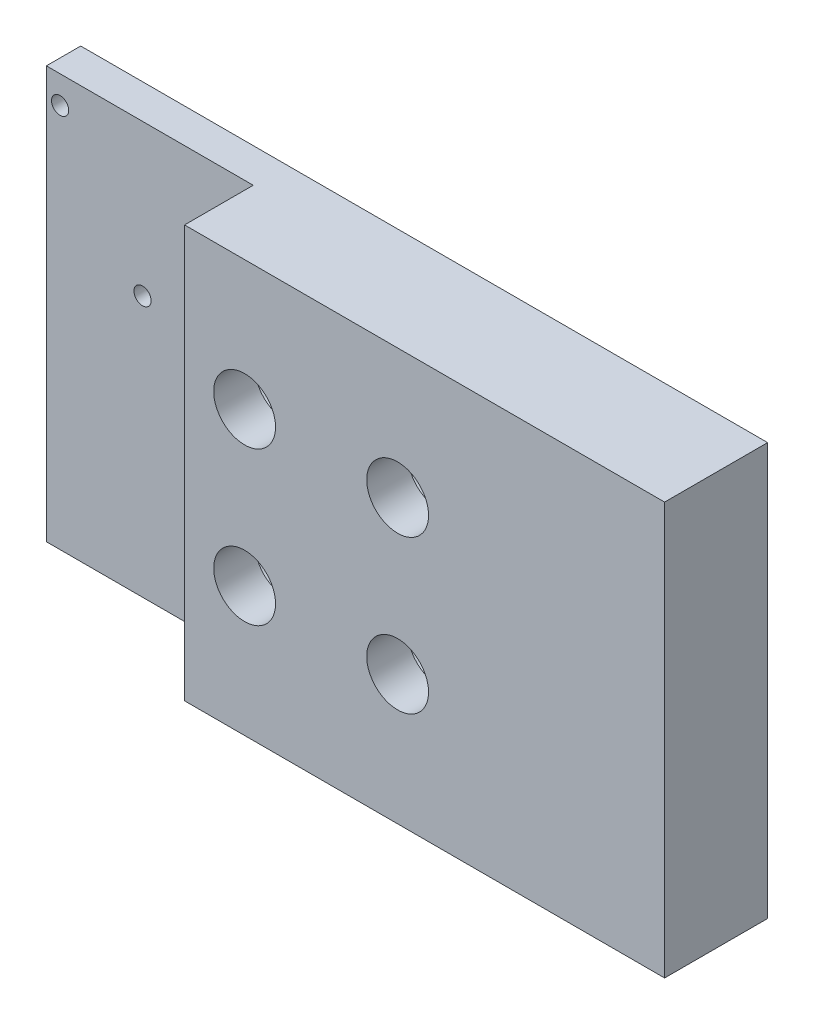
ISO-10303-21;
HEADER;
FILE_DESCRIPTION(('STEP AP214'),'2;1');
FILE_NAME('part.step','',(''),(''),'','','');
FILE_SCHEMA(('AUTOMOTIVE_DESIGN { 1 0 10303 214 1 1 1 1 }'));
ENDSEC;
DATA;
#1=APPLICATION_CONTEXT('core data for automotive mechanical design processes');
#2=APPLICATION_PROTOCOL_DEFINITION('international standard','automotive_design',2000,#1);
#3=PRODUCT_CONTEXT('',#1,'mechanical');
#4=PRODUCT('Part','Part','',(#3));
#5=PRODUCT_RELATED_PRODUCT_CATEGORY('part','',(#4));
#6=PRODUCT_DEFINITION_FORMATION('','',#4);
#7=PRODUCT_DEFINITION_CONTEXT('part definition',#1,'design');
#8=PRODUCT_DEFINITION('design','',#6,#7);
#9=PRODUCT_DEFINITION_SHAPE('','',#8);
#10=(LENGTH_UNIT() NAMED_UNIT(*) SI_UNIT(.MILLI.,.METRE.));
#11=(NAMED_UNIT(*) PLANE_ANGLE_UNIT() SI_UNIT($,.RADIAN.));
#12=(NAMED_UNIT(*) SI_UNIT($,.STERADIAN.) SOLID_ANGLE_UNIT());
#13=UNCERTAINTY_MEASURE_WITH_UNIT(LENGTH_MEASURE(1.E-05),#10,'distance_accuracy_value','');
#14=(GEOMETRIC_REPRESENTATION_CONTEXT(3) GLOBAL_UNCERTAINTY_ASSIGNED_CONTEXT((#13)) GLOBAL_UNIT_ASSIGNED_CONTEXT((#10,
#11,#12)) REPRESENTATION_CONTEXT('',''));
#15=CARTESIAN_POINT('',(0.,0.,0.));
#16=DIRECTION('',(0.,0.,1.));
#17=DIRECTION('',(1.,0.,0.));
#18=AXIS2_PLACEMENT_3D('',#15,#16,#17);
#19=CARTESIAN_POINT('',(-50.,30.,15.));
#20=DIRECTION('',(1.,0.,0.));
#21=DIRECTION('',(0.,0.,-1.));
#22=AXIS2_PLACEMENT_3D('',#19,#20,#21);
#23=PLANE('',#22);
#24=DIRECTION('',(0.,-1.,0.));
#25=VECTOR('',#24,1.);
#26=CARTESIAN_POINT('',(-50.,30.,5.));
#27=LINE('',#26,#25);
#28=CARTESIAN_POINT('',(-50.,30.,5.));
#29=VERTEX_POINT('',#28);
#30=CARTESIAN_POINT('',(-50.,-30.,5.));
#31=VERTEX_POINT('',#30);
#32=EDGE_CURVE('E188',#29,#31,#27,.T.);
#33=ORIENTED_EDGE('',*,*,#32,.F.);
#34=DIRECTION('',(0.,0.,-1.));
#35=VECTOR('',#34,1.);
#36=CARTESIAN_POINT('',(-50.,30.,15.));
#37=LINE('',#36,#35);
#38=CARTESIAN_POINT('',(-50.,30.,0.));
#39=VERTEX_POINT('',#38);
#40=EDGE_CURVE('E44',#29,#39,#37,.T.);
#41=ORIENTED_EDGE('',*,*,#40,.T.);
#42=DIRECTION('',(0.,-1.,0.));
#43=VECTOR('',#42,1.);
#44=CARTESIAN_POINT('',(-50.,30.,0.));
#45=LINE('',#44,#43);
#46=CARTESIAN_POINT('',(-50.,-30.,0.));
#47=VERTEX_POINT('',#46);
#48=EDGE_CURVE('E92',#39,#47,#45,.T.);
#49=ORIENTED_EDGE('',*,*,#48,.T.);
#50=DIRECTION('',(0.,0.,-1.));
#51=VECTOR('',#50,1.);
#52=CARTESIAN_POINT('',(-50.,-30.,15.));
#53=LINE('',#52,#51);
#54=EDGE_CURVE('E86',#31,#47,#53,.T.);
#55=ORIENTED_EDGE('',*,*,#54,.F.);
#56=EDGE_LOOP('',(#33,#41,#49,#55));
#57=FACE_BOUND('',#56,.T.);
#58=ADVANCED_FACE('F35',(#57),#23,.F.);
#59=CARTESIAN_POINT('',(50.,30.,15.));
#60=DIRECTION('',(-1.,0.,0.));
#61=DIRECTION('',(0.,0.,1.));
#62=AXIS2_PLACEMENT_3D('',#59,#60,#61);
#63=PLANE('',#62);
#64=DIRECTION('',(0.,1.,0.));
#65=VECTOR('',#64,1.);
#66=CARTESIAN_POINT('',(50.,30.,0.));
#67=LINE('',#66,#65);
#68=CARTESIAN_POINT('',(50.,-30.,0.));
#69=VERTEX_POINT('',#68);
#70=CARTESIAN_POINT('',(50.,30.,0.));
#71=VERTEX_POINT('',#70);
#72=EDGE_CURVE('E97',#69,#71,#67,.T.);
#73=ORIENTED_EDGE('',*,*,#72,.T.);
#74=DIRECTION('',(0.,0.,-1.));
#75=VECTOR('',#74,1.);
#76=CARTESIAN_POINT('',(50.,30.,15.));
#77=LINE('',#76,#75);
#78=CARTESIAN_POINT('',(50.,30.,15.));
#79=VERTEX_POINT('',#78);
#80=EDGE_CURVE('E11',#79,#71,#77,.T.);
#81=ORIENTED_EDGE('',*,*,#80,.F.);
#82=DIRECTION('',(0.,1.,0.));
#83=VECTOR('',#82,1.);
#84=CARTESIAN_POINT('',(50.,30.,15.));
#85=LINE('',#84,#83);
#86=CARTESIAN_POINT('',(50.,-30.,15.));
#87=VERTEX_POINT('',#86);
#88=EDGE_CURVE('E91',#87,#79,#85,.T.);
#89=ORIENTED_EDGE('',*,*,#88,.F.);
#90=DIRECTION('',(0.,0.,-1.));
#91=VECTOR('',#90,1.);
#92=CARTESIAN_POINT('',(50.,-30.,15.));
#93=LINE('',#92,#91);
#94=EDGE_CURVE('E82',#87,#69,#93,.T.);
#95=ORIENTED_EDGE('',*,*,#94,.T.);
#96=EDGE_LOOP('',(#73,#81,#89,#95));
#97=FACE_BOUND('',#96,.T.);
#98=ADVANCED_FACE('F37',(#97),#63,.F.);
#99=CARTESIAN_POINT('',(-50.,30.,15.));
#100=DIRECTION('',(0.,-1.,0.));
#101=DIRECTION('',(0.,0.,-1.));
#102=AXIS2_PLACEMENT_3D('',#99,#100,#101);
#103=PLANE('',#102);
#104=DIRECTION('',(-1.,0.,0.));
#105=VECTOR('',#104,1.);
#106=CARTESIAN_POINT('',(-19.8843554101842,30.,5.));
#107=LINE('',#106,#105);
#108=CARTESIAN_POINT('',(-19.8843554101842,30.,5.));
#109=VERTEX_POINT('',#108);
#110=EDGE_CURVE('E175',#109,#29,#107,.T.);
#111=ORIENTED_EDGE('',*,*,#110,.F.);
#112=DIRECTION('',(0.,0.,1.));
#113=VECTOR('',#112,1.);
#114=CARTESIAN_POINT('',(-19.8843554101842,30.,5.));
#115=LINE('',#114,#113);
#116=CARTESIAN_POINT('',(-19.8843554101842,30.,15.));
#117=VERTEX_POINT('',#116);
#118=EDGE_CURVE('E172',#109,#117,#115,.T.);
#119=ORIENTED_EDGE('',*,*,#118,.T.);
#120=DIRECTION('',(-1.,0.,0.));
#121=VECTOR('',#120,1.);
#122=CARTESIAN_POINT('',(-50.,30.,15.));
#123=LINE('',#122,#121);
#124=EDGE_CURVE('E160',#79,#117,#123,.T.);
#125=ORIENTED_EDGE('',*,*,#124,.F.);
#126=ORIENTED_EDGE('',*,*,#80,.T.);
#127=DIRECTION('',(-1.,0.,0.));
#128=VECTOR('',#127,1.);
#129=CARTESIAN_POINT('',(-50.,30.,0.));
#130=LINE('',#129,#128);
#131=EDGE_CURVE('E101',#71,#39,#130,.T.);
#132=ORIENTED_EDGE('',*,*,#131,.T.);
#133=ORIENTED_EDGE('',*,*,#40,.F.);
#134=EDGE_LOOP('',(#111,#119,#125,#126,#132,#133));
#135=FACE_BOUND('',#134,.T.);
#136=ADVANCED_FACE('F170',(#135),#103,.F.);
#137=CARTESIAN_POINT('',(-50.,-30.,15.));
#138=DIRECTION('',(0.,1.,0.));
#139=DIRECTION('',(0.,0.,1.));
#140=AXIS2_PLACEMENT_3D('',#137,#138,#139);
#141=PLANE('',#140);
#142=DIRECTION('',(1.,0.,0.));
#143=VECTOR('',#142,1.);
#144=CARTESIAN_POINT('',(-50.,-30.,15.));
#145=LINE('',#144,#143);
#146=CARTESIAN_POINT('',(-19.8843554101842,-30.,15.));
#147=VERTEX_POINT('',#146);
#148=EDGE_CURVE('E60',#147,#87,#145,.T.);
#149=ORIENTED_EDGE('',*,*,#148,.F.);
#150=DIRECTION('',(0.,0.,1.));
#151=VECTOR('',#150,1.);
#152=CARTESIAN_POINT('',(-19.8843554101842,-30.,5.));
#153=LINE('',#152,#151);
#154=CARTESIAN_POINT('',(-19.8843554101842,-30.,5.));
#155=VERTEX_POINT('',#154);
#156=EDGE_CURVE('E52',#155,#147,#153,.T.);
#157=ORIENTED_EDGE('',*,*,#156,.F.);
#158=DIRECTION('',(1.,0.,0.));
#159=VECTOR('',#158,1.);
#160=CARTESIAN_POINT('',(-50.,-30.,5.));
#161=LINE('',#160,#159);
#162=EDGE_CURVE('E185',#31,#155,#161,.T.);
#163=ORIENTED_EDGE('',*,*,#162,.F.);
#164=ORIENTED_EDGE('',*,*,#54,.T.);
#165=DIRECTION('',(1.,0.,0.));
#166=VECTOR('',#165,1.);
#167=CARTESIAN_POINT('',(-50.,-30.,0.));
#168=LINE('',#167,#166);
#169=EDGE_CURVE('E79',#47,#69,#168,.T.);
#170=ORIENTED_EDGE('',*,*,#169,.T.);
#171=ORIENTED_EDGE('',*,*,#94,.F.);
#172=EDGE_LOOP('',(#149,#157,#163,#164,#170,#171));
#173=FACE_BOUND('',#172,.T.);
#174=ADVANCED_FACE('F81',(#173),#141,.F.);
#175=CARTESIAN_POINT('',(0.,0.,15.));
#176=DIRECTION('',(0.,0.,1.));
#177=DIRECTION('',(1.,0.,0.));
#178=AXIS2_PLACEMENT_3D('',#175,#176,#177);
#179=PLANE('',#178);
#180=DIRECTION('',(0.,1.,0.));
#181=VECTOR('',#180,1.);
#182=CARTESIAN_POINT('',(-19.8843554101842,30.,15.));
#183=LINE('',#182,#181);
#184=EDGE_CURVE('E165',#147,#117,#183,.T.);
#185=ORIENTED_EDGE('',*,*,#184,.F.);
#186=ORIENTED_EDGE('',*,*,#148,.T.);
#187=ORIENTED_EDGE('',*,*,#88,.T.);
#188=ORIENTED_EDGE('',*,*,#124,.T.);
#189=EDGE_LOOP('',(#185,#186,#187,#188));
#190=FACE_BOUND('',#189,.T.);
#191=CARTESIAN_POINT('',(-11.1369318036881,11.1369318036881,15.));
#192=DIRECTION('',(0.,0.,1.));
#193=DIRECTION('',(1.,0.,0.));
#194=AXIS2_PLACEMENT_3D('',#191,#192,#193);
#195=CIRCLE('',#194,4.5);
#196=CARTESIAN_POINT('',(-6.63693180368812,11.1369318036881,15.));
#197=VERTEX_POINT('',#196);
#198=EDGE_CURVE('E117',#197,#197,#195,.T.);
#199=ORIENTED_EDGE('',*,*,#198,.F.);
#200=EDGE_LOOP('',(#199));
#201=FACE_BOUND('',#200,.T.);
#202=CARTESIAN_POINT('',(11.1369318036881,11.1369318036881,15.));
#203=DIRECTION('',(0.,0.,1.));
#204=DIRECTION('',(1.,0.,0.));
#205=AXIS2_PLACEMENT_3D('',#202,#203,#204);
#206=CIRCLE('',#205,4.5);
#207=CARTESIAN_POINT('',(15.6369318036881,11.1369318036881,15.));
#208=VERTEX_POINT('',#207);
#209=EDGE_CURVE('E146',#208,#208,#206,.T.);
#210=ORIENTED_EDGE('',*,*,#209,.F.);
#211=EDGE_LOOP('',(#210));
#212=FACE_BOUND('',#211,.T.);
#213=CARTESIAN_POINT('',(-11.1369318036881,-11.1369318036881,15.));
#214=DIRECTION('',(0.,0.,1.));
#215=DIRECTION('',(1.,0.,0.));
#216=AXIS2_PLACEMENT_3D('',#213,#214,#215);
#217=CIRCLE('',#216,4.5);
#218=CARTESIAN_POINT('',(-6.63693180368809,-11.1369318036881,15.));
#219=VERTEX_POINT('',#218);
#220=EDGE_CURVE('E152',#219,#219,#217,.T.);
#221=ORIENTED_EDGE('',*,*,#220,.F.);
#222=EDGE_LOOP('',(#221));
#223=FACE_BOUND('',#222,.T.);
#224=CARTESIAN_POINT('',(11.1369318036881,-11.1369318036881,15.));
#225=DIRECTION('',(0.,0.,1.));
#226=DIRECTION('',(1.,0.,0.));
#227=AXIS2_PLACEMENT_3D('',#224,#225,#226);
#228=CIRCLE('',#227,4.5);
#229=CARTESIAN_POINT('',(15.6369318036881,-11.1369318036881,15.));
#230=VERTEX_POINT('',#229);
#231=EDGE_CURVE('E106',#230,#230,#228,.T.);
#232=ORIENTED_EDGE('',*,*,#231,.F.);
#233=EDGE_LOOP('',(#232));
#234=FACE_BOUND('',#233,.T.);
#235=ADVANCED_FACE('F163',(#190,#201,#212,#223,#234),#179,.T.);
#236=CARTESIAN_POINT('',(0.,0.,0.));
#237=DIRECTION('',(0.,0.,1.));
#238=DIRECTION('',(1.,0.,0.));
#239=AXIS2_PLACEMENT_3D('',#236,#237,#238);
#240=PLANE('',#239);
#241=CARTESIAN_POINT('',(-36.,8.,0.));
#242=DIRECTION('',(0.,0.,-1.));
#243=DIRECTION('',(-1.,0.,0.));
#244=AXIS2_PLACEMENT_3D('',#241,#242,#243);
#245=CIRCLE('',#244,1.25);
#246=CARTESIAN_POINT('',(-37.25,8.,0.));
#247=VERTEX_POINT('',#246);
#248=EDGE_CURVE('E197',#247,#247,#245,.T.);
#249=ORIENTED_EDGE('',*,*,#248,.F.);
#250=EDGE_LOOP('',(#249));
#251=FACE_BOUND('',#250,.T.);
#252=CARTESIAN_POINT('',(-48.,26.,0.));
#253=DIRECTION('',(0.,0.,-1.));
#254=DIRECTION('',(-1.,0.,0.));
#255=AXIS2_PLACEMENT_3D('',#252,#253,#254);
#256=CIRCLE('',#255,1.25);
#257=CARTESIAN_POINT('',(-49.25,26.,0.));
#258=VERTEX_POINT('',#257);
#259=EDGE_CURVE('E194',#258,#258,#256,.T.);
#260=ORIENTED_EDGE('',*,*,#259,.F.);
#261=EDGE_LOOP('',(#260));
#262=FACE_BOUND('',#261,.T.);
#263=CARTESIAN_POINT('',(-11.1369318036881,11.1369318036881,0.));
#264=DIRECTION('',(0.,0.,1.));
#265=DIRECTION('',(1.,0.,0.));
#266=AXIS2_PLACEMENT_3D('',#263,#264,#265);
#267=CIRCLE('',#266,2.09999999999999);
#268=CARTESIAN_POINT('',(-9.03693180368813,11.1369318036881,0.));
#269=VERTEX_POINT('',#268);
#270=EDGE_CURVE('E135',#269,#269,#267,.T.);
#271=ORIENTED_EDGE('',*,*,#270,.T.);
#272=EDGE_LOOP('',(#271));
#273=FACE_BOUND('',#272,.T.);
#274=CARTESIAN_POINT('',(11.1369318036881,11.1369318036881,0.));
#275=DIRECTION('',(0.,0.,1.));
#276=DIRECTION('',(1.,0.,0.));
#277=AXIS2_PLACEMENT_3D('',#274,#275,#276);
#278=CIRCLE('',#277,2.09999999999999);
#279=CARTESIAN_POINT('',(13.2369318036881,11.1369318036881,0.));
#280=VERTEX_POINT('',#279);
#281=EDGE_CURVE('E124',#280,#280,#278,.T.);
#282=ORIENTED_EDGE('',*,*,#281,.T.);
#283=EDGE_LOOP('',(#282));
#284=FACE_BOUND('',#283,.T.);
#285=CARTESIAN_POINT('',(11.1369318036881,-11.1369318036881,0.));
#286=DIRECTION('',(0.,0.,1.));
#287=DIRECTION('',(1.,0.,0.));
#288=AXIS2_PLACEMENT_3D('',#285,#286,#287);
#289=CIRCLE('',#288,2.09999999999999);
#290=CARTESIAN_POINT('',(13.2369318036881,-11.1369318036881,0.));
#291=VERTEX_POINT('',#290);
#292=EDGE_CURVE('E121',#291,#291,#289,.T.);
#293=ORIENTED_EDGE('',*,*,#292,.T.);
#294=EDGE_LOOP('',(#293));
#295=FACE_BOUND('',#294,.T.);
#296=CARTESIAN_POINT('',(-11.1369318036881,-11.1369318036881,0.));
#297=DIRECTION('',(0.,0.,1.));
#298=DIRECTION('',(1.,0.,0.));
#299=AXIS2_PLACEMENT_3D('',#296,#297,#298);
#300=CIRCLE('',#299,2.09999999999999);
#301=CARTESIAN_POINT('',(-9.03693180368811,-11.1369318036881,0.));
#302=VERTEX_POINT('',#301);
#303=EDGE_CURVE('E118',#302,#302,#300,.T.);
#304=ORIENTED_EDGE('',*,*,#303,.T.);
#305=EDGE_LOOP('',(#304));
#306=FACE_BOUND('',#305,.T.);
#307=ORIENTED_EDGE('',*,*,#72,.F.);
#308=ORIENTED_EDGE('',*,*,#169,.F.);
#309=ORIENTED_EDGE('',*,*,#48,.F.);
#310=ORIENTED_EDGE('',*,*,#131,.F.);
#311=EDGE_LOOP('',(#307,#308,#309,#310));
#312=FACE_BOUND('',#311,.T.);
#313=ADVANCED_FACE('F99',(#251,#262,#273,#284,#295,#306,#312),#240,.F.);
#314=CARTESIAN_POINT('',(11.1369318036881,-11.1369318036881,9.));
#315=DIRECTION('',(0.,0.,1.));
#316=DIRECTION('',(1.,0.,0.));
#317=AXIS2_PLACEMENT_3D('',#314,#315,#316);
#318=CONICAL_SURFACE('',#317,4.5,1.02974425867665);
#319=CARTESIAN_POINT('',(11.1369318036881,-11.1369318036881,7.55793451433385));
#320=DIRECTION('',(0.,0.,1.));
#321=DIRECTION('',(1.,0.,0.));
#322=AXIS2_PLACEMENT_3D('',#319,#320,#321);
#323=CIRCLE('',#322,2.09999999999999);
#324=CARTESIAN_POINT('',(13.2369318036881,-11.1369318036881,7.55793451433385));
#325=VERTEX_POINT('',#324);
#326=EDGE_CURVE('E119',#325,#325,#323,.F.);
#327=ORIENTED_EDGE('',*,*,#326,.T.);
#328=EDGE_LOOP('',(#327));
#329=FACE_BOUND('',#328,.T.);
#330=CARTESIAN_POINT('',(11.1369318036881,-11.1369318036881,9.));
#331=DIRECTION('',(0.,0.,1.));
#332=DIRECTION('',(1.,0.,0.));
#333=AXIS2_PLACEMENT_3D('',#330,#331,#332);
#334=CIRCLE('',#333,4.5);
#335=CARTESIAN_POINT('',(15.6369318036881,-11.1369318036881,9.));
#336=VERTEX_POINT('',#335);
#337=EDGE_CURVE('E102',#336,#336,#334,.T.);
#338=ORIENTED_EDGE('',*,*,#337,.T.);
#339=EDGE_LOOP('',(#338));
#340=FACE_BOUND('',#339,.T.);
#341=ADVANCED_FACE('F249',(#329,#340),#318,.F.);
#342=CARTESIAN_POINT('',(11.1369318036881,-11.1369318036881,15.));
#343=DIRECTION('',(0.,0.,1.));
#344=DIRECTION('',(1.,0.,0.));
#345=AXIS2_PLACEMENT_3D('',#342,#343,#344);
#346=CYLINDRICAL_SURFACE('',#345,4.5);
#347=ORIENTED_EDGE('',*,*,#337,.F.);
#348=EDGE_LOOP('',(#347));
#349=FACE_BOUND('',#348,.T.);
#350=ORIENTED_EDGE('',*,*,#231,.T.);
#351=EDGE_LOOP('',(#350));
#352=FACE_BOUND('',#351,.T.);
#353=ADVANCED_FACE('F254',(#349,#352),#346,.F.);
#354=CARTESIAN_POINT('',(-11.1369318036881,-11.1369318036881,9.));
#355=DIRECTION('',(0.,0.,1.));
#356=DIRECTION('',(1.,0.,0.));
#357=AXIS2_PLACEMENT_3D('',#354,#355,#356);
#358=CONICAL_SURFACE('',#357,4.5,1.02974425867665);
#359=CARTESIAN_POINT('',(-11.1369318036881,-11.1369318036881,7.55793451433385));
#360=DIRECTION('',(0.,0.,1.));
#361=DIRECTION('',(1.,0.,0.));
#362=AXIS2_PLACEMENT_3D('',#359,#360,#361);
#363=CIRCLE('',#362,2.09999999999999);
#364=CARTESIAN_POINT('',(-9.03693180368811,-11.1369318036881,7.55793451433385));
#365=VERTEX_POINT('',#364);
#366=EDGE_CURVE('E114',#365,#365,#363,.F.);
#367=ORIENTED_EDGE('',*,*,#366,.T.);
#368=EDGE_LOOP('',(#367));
#369=FACE_BOUND('',#368,.T.);
#370=CARTESIAN_POINT('',(-11.1369318036881,-11.1369318036881,9.));
#371=DIRECTION('',(0.,0.,1.));
#372=DIRECTION('',(1.,0.,0.));
#373=AXIS2_PLACEMENT_3D('',#370,#371,#372);
#374=CIRCLE('',#373,4.5);
#375=CARTESIAN_POINT('',(-6.63693180368809,-11.1369318036881,9.));
#376=VERTEX_POINT('',#375);
#377=EDGE_CURVE('E155',#376,#376,#374,.T.);
#378=ORIENTED_EDGE('',*,*,#377,.T.);
#379=EDGE_LOOP('',(#378));
#380=FACE_BOUND('',#379,.T.);
#381=ADVANCED_FACE('F258',(#369,#380),#358,.F.);
#382=CARTESIAN_POINT('',(-11.1369318036881,-11.1369318036881,15.));
#383=DIRECTION('',(0.,0.,1.));
#384=DIRECTION('',(1.,0.,0.));
#385=AXIS2_PLACEMENT_3D('',#382,#383,#384);
#386=CYLINDRICAL_SURFACE('',#385,4.5);
#387=ORIENTED_EDGE('',*,*,#377,.F.);
#388=EDGE_LOOP('',(#387));
#389=FACE_BOUND('',#388,.T.);
#390=ORIENTED_EDGE('',*,*,#220,.T.);
#391=EDGE_LOOP('',(#390));
#392=FACE_BOUND('',#391,.T.);
#393=ADVANCED_FACE('F262',(#389,#392),#386,.F.);
#394=CARTESIAN_POINT('',(11.1369318036881,11.1369318036881,9.));
#395=DIRECTION('',(0.,0.,1.));
#396=DIRECTION('',(1.,0.,0.));
#397=AXIS2_PLACEMENT_3D('',#394,#395,#396);
#398=CONICAL_SURFACE('',#397,4.5,1.02974425867665);
#399=CARTESIAN_POINT('',(11.1369318036881,11.1369318036881,7.55793451433385));
#400=DIRECTION('',(0.,0.,1.));
#401=DIRECTION('',(1.,0.,0.));
#402=AXIS2_PLACEMENT_3D('',#399,#400,#401);
#403=CIRCLE('',#402,2.09999999999999);
#404=CARTESIAN_POINT('',(13.2369318036881,11.1369318036881,7.55793451433385));
#405=VERTEX_POINT('',#404);
#406=EDGE_CURVE('E122',#405,#405,#403,.F.);
#407=ORIENTED_EDGE('',*,*,#406,.T.);
#408=EDGE_LOOP('',(#407));
#409=FACE_BOUND('',#408,.T.);
#410=CARTESIAN_POINT('',(11.1369318036881,11.1369318036881,9.));
#411=DIRECTION('',(0.,0.,1.));
#412=DIRECTION('',(1.,0.,0.));
#413=AXIS2_PLACEMENT_3D('',#410,#411,#412);
#414=CIRCLE('',#413,4.5);
#415=CARTESIAN_POINT('',(15.6369318036881,11.1369318036881,9.));
#416=VERTEX_POINT('',#415);
#417=EDGE_CURVE('E149',#416,#416,#414,.T.);
#418=ORIENTED_EDGE('',*,*,#417,.T.);
#419=EDGE_LOOP('',(#418));
#420=FACE_BOUND('',#419,.T.);
#421=ADVANCED_FACE('F266',(#409,#420),#398,.F.);
#422=CARTESIAN_POINT('',(11.1369318036881,11.1369318036881,15.));
#423=DIRECTION('',(0.,0.,1.));
#424=DIRECTION('',(1.,0.,0.));
#425=AXIS2_PLACEMENT_3D('',#422,#423,#424);
#426=CYLINDRICAL_SURFACE('',#425,4.5);
#427=ORIENTED_EDGE('',*,*,#417,.F.);
#428=EDGE_LOOP('',(#427));
#429=FACE_BOUND('',#428,.T.);
#430=ORIENTED_EDGE('',*,*,#209,.T.);
#431=EDGE_LOOP('',(#430));
#432=FACE_BOUND('',#431,.T.);
#433=ADVANCED_FACE('F270',(#429,#432),#426,.F.);
#434=CARTESIAN_POINT('',(-11.1369318036881,11.1369318036881,9.));
#435=DIRECTION('',(0.,0.,1.));
#436=DIRECTION('',(1.,0.,0.));
#437=AXIS2_PLACEMENT_3D('',#434,#435,#436);
#438=CONICAL_SURFACE('',#437,4.5,1.02974425867665);
#439=CARTESIAN_POINT('',(-11.1369318036881,11.1369318036881,7.55793451433385));
#440=DIRECTION('',(0.,0.,1.));
#441=DIRECTION('',(1.,0.,0.));
#442=AXIS2_PLACEMENT_3D('',#439,#440,#441);
#443=CIRCLE('',#442,2.09999999999999);
#444=CARTESIAN_POINT('',(-9.03693180368813,11.1369318036881,7.55793451433385));
#445=VERTEX_POINT('',#444);
#446=EDGE_CURVE('E130',#445,#445,#443,.F.);
#447=ORIENTED_EDGE('',*,*,#446,.T.);
#448=EDGE_LOOP('',(#447));
#449=FACE_BOUND('',#448,.T.);
#450=CARTESIAN_POINT('',(-11.1369318036881,11.1369318036881,9.));
#451=DIRECTION('',(0.,0.,1.));
#452=DIRECTION('',(1.,0.,0.));
#453=AXIS2_PLACEMENT_3D('',#450,#451,#452);
#454=CIRCLE('',#453,4.5);
#455=CARTESIAN_POINT('',(-6.63693180368812,11.1369318036881,9.));
#456=VERTEX_POINT('',#455);
#457=EDGE_CURVE('E143',#456,#456,#454,.T.);
#458=ORIENTED_EDGE('',*,*,#457,.T.);
#459=EDGE_LOOP('',(#458));
#460=FACE_BOUND('',#459,.T.);
#461=ADVANCED_FACE('F273',(#449,#460),#438,.F.);
#462=CARTESIAN_POINT('',(-11.1369318036881,11.1369318036881,15.));
#463=DIRECTION('',(0.,0.,1.));
#464=DIRECTION('',(1.,0.,0.));
#465=AXIS2_PLACEMENT_3D('',#462,#463,#464);
#466=CYLINDRICAL_SURFACE('',#465,4.5);
#467=ORIENTED_EDGE('',*,*,#457,.F.);
#468=EDGE_LOOP('',(#467));
#469=FACE_BOUND('',#468,.T.);
#470=ORIENTED_EDGE('',*,*,#198,.T.);
#471=EDGE_LOOP('',(#470));
#472=FACE_BOUND('',#471,.T.);
#473=ADVANCED_FACE('F277',(#469,#472),#466,.F.);
#474=CARTESIAN_POINT('',(-11.1369318036881,-11.1369318036881,15.));
#475=DIRECTION('',(0.,0.,1.));
#476=DIRECTION('',(1.,0.,0.));
#477=AXIS2_PLACEMENT_3D('',#474,#475,#476);
#478=CYLINDRICAL_SURFACE('',#477,2.09999999999999);
#479=ORIENTED_EDGE('',*,*,#303,.F.);
#480=EDGE_LOOP('',(#479));
#481=FACE_BOUND('',#480,.T.);
#482=ORIENTED_EDGE('',*,*,#366,.F.);
#483=EDGE_LOOP('',(#482));
#484=FACE_BOUND('',#483,.T.);
#485=ADVANCED_FACE('F281',(#481,#484),#478,.F.);
#486=CARTESIAN_POINT('',(11.1369318036881,-11.1369318036881,15.));
#487=DIRECTION('',(0.,0.,1.));
#488=DIRECTION('',(1.,0.,0.));
#489=AXIS2_PLACEMENT_3D('',#486,#487,#488);
#490=CYLINDRICAL_SURFACE('',#489,2.09999999999999);
#491=ORIENTED_EDGE('',*,*,#292,.F.);
#492=EDGE_LOOP('',(#491));
#493=FACE_BOUND('',#492,.T.);
#494=ORIENTED_EDGE('',*,*,#326,.F.);
#495=EDGE_LOOP('',(#494));
#496=FACE_BOUND('',#495,.T.);
#497=ADVANCED_FACE('F285',(#493,#496),#490,.F.);
#498=CARTESIAN_POINT('',(11.1369318036881,11.1369318036881,15.));
#499=DIRECTION('',(0.,0.,1.));
#500=DIRECTION('',(1.,0.,0.));
#501=AXIS2_PLACEMENT_3D('',#498,#499,#500);
#502=CYLINDRICAL_SURFACE('',#501,2.09999999999999);
#503=ORIENTED_EDGE('',*,*,#281,.F.);
#504=EDGE_LOOP('',(#503));
#505=FACE_BOUND('',#504,.T.);
#506=ORIENTED_EDGE('',*,*,#406,.F.);
#507=EDGE_LOOP('',(#506));
#508=FACE_BOUND('',#507,.T.);
#509=ADVANCED_FACE('F228',(#505,#508),#502,.F.);
#510=CARTESIAN_POINT('',(-11.1369318036881,11.1369318036881,15.));
#511=DIRECTION('',(0.,0.,1.));
#512=DIRECTION('',(1.,0.,0.));
#513=AXIS2_PLACEMENT_3D('',#510,#511,#512);
#514=CYLINDRICAL_SURFACE('',#513,2.09999999999999);
#515=ORIENTED_EDGE('',*,*,#270,.F.);
#516=EDGE_LOOP('',(#515));
#517=FACE_BOUND('',#516,.T.);
#518=ORIENTED_EDGE('',*,*,#446,.F.);
#519=EDGE_LOOP('',(#518));
#520=FACE_BOUND('',#519,.T.);
#521=ADVANCED_FACE('F223',(#517,#520),#514,.F.);
#522=CARTESIAN_POINT('',(-19.8843554101842,30.,5.));
#523=DIRECTION('',(1.,0.,0.));
#524=DIRECTION('',(0.,1.,0.));
#525=AXIS2_PLACEMENT_3D('',#522,#523,#524);
#526=PLANE('',#525);
#527=ORIENTED_EDGE('',*,*,#184,.T.);
#528=ORIENTED_EDGE('',*,*,#118,.F.);
#529=DIRECTION('',(0.,1.,0.));
#530=VECTOR('',#529,1.);
#531=CARTESIAN_POINT('',(-19.8843554101842,30.,5.));
#532=LINE('',#531,#530);
#533=EDGE_CURVE('E179',#155,#109,#532,.T.);
#534=ORIENTED_EDGE('',*,*,#533,.F.);
#535=ORIENTED_EDGE('',*,*,#156,.T.);
#536=EDGE_LOOP('',(#527,#528,#534,#535));
#537=FACE_BOUND('',#536,.T.);
#538=ADVANCED_FACE('F210',(#537),#526,.F.);
#539=CARTESIAN_POINT('',(0.,0.,5.));
#540=DIRECTION('',(0.,0.,1.));
#541=DIRECTION('',(1.,0.,0.));
#542=AXIS2_PLACEMENT_3D('',#539,#540,#541);
#543=PLANE('',#542);
#544=CARTESIAN_POINT('',(-36.,8.,5.));
#545=DIRECTION('',(0.,0.,1.));
#546=DIRECTION('',(1.,0.,0.));
#547=AXIS2_PLACEMENT_3D('',#544,#545,#546);
#548=CIRCLE('',#547,1.25);
#549=CARTESIAN_POINT('',(-34.75,8.,5.));
#550=VERTEX_POINT('',#549);
#551=EDGE_CURVE('E39',#550,#550,#548,.T.);
#552=ORIENTED_EDGE('',*,*,#551,.F.);
#553=EDGE_LOOP('',(#552));
#554=FACE_BOUND('',#553,.T.);
#555=CARTESIAN_POINT('',(-48.,26.,5.));
#556=DIRECTION('',(0.,0.,1.));
#557=DIRECTION('',(1.,0.,0.));
#558=AXIS2_PLACEMENT_3D('',#555,#556,#557);
#559=CIRCLE('',#558,1.25);
#560=CARTESIAN_POINT('',(-46.75,26.,5.));
#561=VERTEX_POINT('',#560);
#562=EDGE_CURVE('E183',#561,#561,#559,.T.);
#563=ORIENTED_EDGE('',*,*,#562,.F.);
#564=EDGE_LOOP('',(#563));
#565=FACE_BOUND('',#564,.T.);
#566=ORIENTED_EDGE('',*,*,#110,.T.);
#567=ORIENTED_EDGE('',*,*,#32,.T.);
#568=ORIENTED_EDGE('',*,*,#162,.T.);
#569=ORIENTED_EDGE('',*,*,#533,.T.);
#570=EDGE_LOOP('',(#566,#567,#568,#569));
#571=FACE_BOUND('',#570,.T.);
#572=ADVANCED_FACE('F206',(#554,#565,#571),#543,.T.);
#573=CARTESIAN_POINT('',(-48.,26.,0.));
#574=DIRECTION('',(0.,0.,-1.));
#575=DIRECTION('',(-1.,0.,0.));
#576=AXIS2_PLACEMENT_3D('',#573,#574,#575);
#577=CYLINDRICAL_SURFACE('',#576,1.25);
#578=ORIENTED_EDGE('',*,*,#562,.T.);
#579=EDGE_LOOP('',(#578));
#580=FACE_BOUND('',#579,.T.);
#581=ORIENTED_EDGE('',*,*,#259,.T.);
#582=EDGE_LOOP('',(#581));
#583=FACE_BOUND('',#582,.T.);
#584=ADVANCED_FACE('F209',(#580,#583),#577,.F.);
#585=CARTESIAN_POINT('',(-36.,8.,0.));
#586=DIRECTION('',(0.,0.,-1.));
#587=DIRECTION('',(-1.,0.,0.));
#588=AXIS2_PLACEMENT_3D('',#585,#586,#587);
#589=CYLINDRICAL_SURFACE('',#588,1.25);
#590=ORIENTED_EDGE('',*,*,#551,.T.);
#591=EDGE_LOOP('',(#590));
#592=FACE_BOUND('',#591,.T.);
#593=ORIENTED_EDGE('',*,*,#248,.T.);
#594=EDGE_LOOP('',(#593));
#595=FACE_BOUND('',#594,.T.);
#596=ADVANCED_FACE('F204',(#592,#595),#589,.F.);
#597=CLOSED_SHELL('',(#58,#98,#136,#174,#235,#313,#341,#353,#381,#393,#421,#433,#461,#473,#485,
#497,#509,#521,#538,#572,#584,#596));
#598=MANIFOLD_SOLID_BREP('B2',#597);
#599=ADVANCED_BREP_SHAPE_REPRESENTATION('',(#18,#598),#14);
#600=SHAPE_DEFINITION_REPRESENTATION(#9,#599);
ENDSEC;
END-ISO-10303-21;
